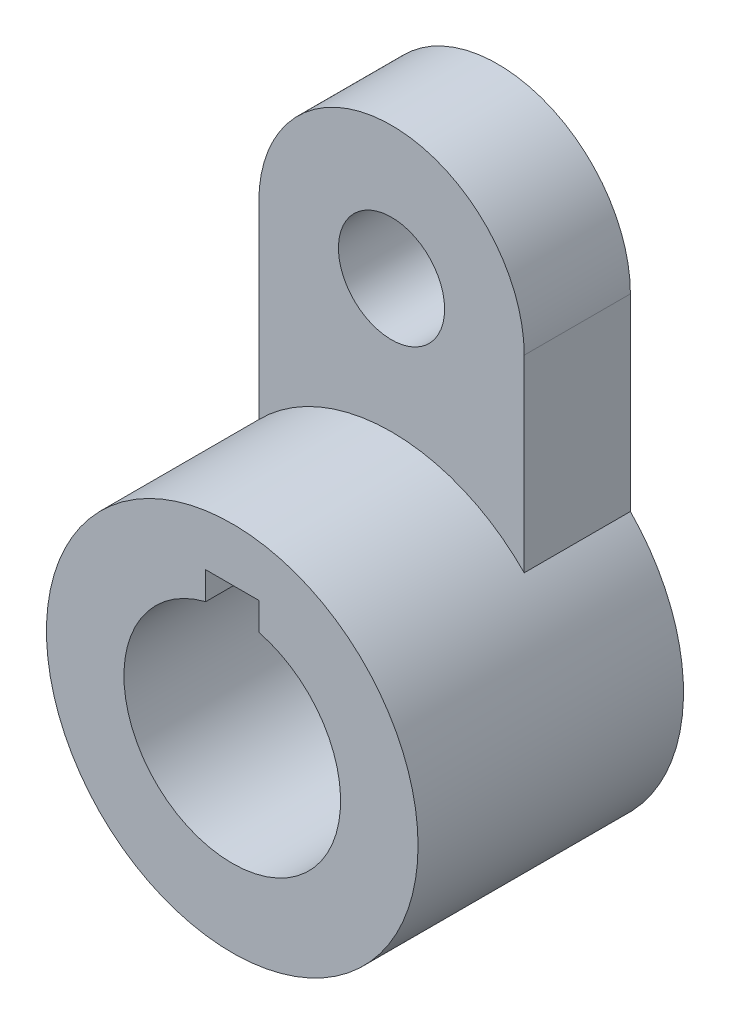
ISO-10303-21;
HEADER;
FILE_DESCRIPTION(('STEP AP214'),'2;1');
FILE_NAME('part.step','',(''),(''),'','','');
FILE_SCHEMA(('AUTOMOTIVE_DESIGN { 1 0 10303 214 1 1 1 1 }'));
ENDSEC;
DATA;
#1=APPLICATION_CONTEXT('core data for automotive mechanical design processes');
#2=APPLICATION_PROTOCOL_DEFINITION('international standard','automotive_design',2000,#1);
#3=PRODUCT_CONTEXT('',#1,'mechanical');
#4=PRODUCT('Part','Part','',(#3));
#5=PRODUCT_RELATED_PRODUCT_CATEGORY('part','',(#4));
#6=PRODUCT_DEFINITION_FORMATION('','',#4);
#7=PRODUCT_DEFINITION_CONTEXT('part definition',#1,'design');
#8=PRODUCT_DEFINITION('design','',#6,#7);
#9=PRODUCT_DEFINITION_SHAPE('','',#8);
#10=(LENGTH_UNIT() NAMED_UNIT(*) SI_UNIT(.MILLI.,.METRE.));
#11=(NAMED_UNIT(*) PLANE_ANGLE_UNIT() SI_UNIT($,.RADIAN.));
#12=(NAMED_UNIT(*) SI_UNIT($,.STERADIAN.) SOLID_ANGLE_UNIT());
#13=UNCERTAINTY_MEASURE_WITH_UNIT(LENGTH_MEASURE(1.E-05),#10,'distance_accuracy_value','');
#14=(GEOMETRIC_REPRESENTATION_CONTEXT(3) GLOBAL_UNCERTAINTY_ASSIGNED_CONTEXT((#13)) GLOBAL_UNIT_ASSIGNED_CONTEXT((#10,
#11,#12)) REPRESENTATION_CONTEXT('',''));
#15=CARTESIAN_POINT('',(0.,0.,0.));
#16=DIRECTION('',(0.,0.,1.));
#17=DIRECTION('',(1.,0.,0.));
#18=AXIS2_PLACEMENT_3D('',#15,#16,#17);
#19=CARTESIAN_POINT('',(0.,0.,31.75));
#20=DIRECTION('',(0.,0.,-1.));
#21=DIRECTION('',(-1.,0.,0.));
#22=AXIS2_PLACEMENT_3D('',#19,#20,#21);
#23=CYLINDRICAL_SURFACE('',#22,22.225);
#24=CARTESIAN_POINT('',(0.,0.,31.75));
#25=DIRECTION('',(0.,0.,1.));
#26=DIRECTION('',(1.,0.,0.));
#27=AXIS2_PLACEMENT_3D('',#24,#25,#26);
#28=CIRCLE('',#27,22.225);
#29=CARTESIAN_POINT('',(22.225,0.,31.75));
#30=VERTEX_POINT('',#29);
#31=EDGE_CURVE('E44',#30,#30,#28,.T.);
#32=ORIENTED_EDGE('',*,*,#31,.F.);
#33=EDGE_LOOP('',(#32));
#34=FACE_BOUND('',#33,.T.);
#35=DIRECTION('',(0.,0.,-1.));
#36=VECTOR('',#35,1.);
#37=CARTESIAN_POINT('',(-15.875,15.5542598666732,31.75));
#38=LINE('',#37,#36);
#39=CARTESIAN_POINT('',(-15.875,15.5542598666732,0.));
#40=VERTEX_POINT('',#39);
#41=CARTESIAN_POINT('',(-15.875,15.5542598666732,12.7));
#42=VERTEX_POINT('',#41);
#43=EDGE_CURVE('E165',#40,#42,#38,.F.);
#44=ORIENTED_EDGE('',*,*,#43,.F.);
#45=CARTESIAN_POINT('',(0.,0.,0.));
#46=DIRECTION('',(0.,0.,1.));
#47=DIRECTION('',(1.,0.,0.));
#48=AXIS2_PLACEMENT_3D('',#45,#46,#47);
#49=CIRCLE('',#48,22.225);
#50=CARTESIAN_POINT('',(15.875,15.5542598666732,0.));
#51=VERTEX_POINT('',#50);
#52=EDGE_CURVE('E168',#40,#51,#49,.T.);
#53=ORIENTED_EDGE('',*,*,#52,.T.);
#54=DIRECTION('',(0.,0.,-1.));
#55=VECTOR('',#54,1.);
#56=CARTESIAN_POINT('',(15.875,15.5542598666732,31.75));
#57=LINE('',#56,#55);
#58=CARTESIAN_POINT('',(15.875,15.5542598666732,12.7));
#59=VERTEX_POINT('',#58);
#60=EDGE_CURVE('E162',#59,#51,#57,.T.);
#61=ORIENTED_EDGE('',*,*,#60,.F.);
#62=CARTESIAN_POINT('',(0.,0.,12.7));
#63=DIRECTION('',(0.,0.,1.));
#64=DIRECTION('',(1.,0.,0.));
#65=AXIS2_PLACEMENT_3D('',#62,#63,#64);
#66=CIRCLE('',#65,22.225);
#67=EDGE_CURVE('E11',#59,#42,#66,.T.);
#68=ORIENTED_EDGE('',*,*,#67,.T.);
#69=EDGE_LOOP('',(#44,#53,#61,#68));
#70=FACE_BOUND('',#69,.T.);
#71=ADVANCED_FACE('F37',(#34,#70),#23,.T.);
#72=CARTESIAN_POINT('',(0.,0.,31.75));
#73=DIRECTION('',(0.,0.,1.));
#74=DIRECTION('',(1.,0.,0.));
#75=AXIS2_PLACEMENT_3D('',#72,#73,#74);
#76=PLANE('',#75);
#77=CARTESIAN_POINT('',(0.,0.,31.75));
#78=DIRECTION('',(0.,0.,1.));
#79=DIRECTION('',(1.,0.,0.));
#80=AXIS2_PLACEMENT_3D('',#77,#78,#79);
#81=CIRCLE('',#80,12.9590100863865);
#82=CARTESIAN_POINT('',(-3.175,12.5640486077963,31.75));
#83=VERTEX_POINT('',#82);
#84=CARTESIAN_POINT('',(3.175,12.5640486077963,31.75));
#85=VERTEX_POINT('',#84);
#86=EDGE_CURVE('E51',#83,#85,#81,.T.);
#87=ORIENTED_EDGE('',*,*,#86,.F.);
#88=DIRECTION('',(0.,-1.,0.));
#89=VECTOR('',#88,1.);
#90=CARTESIAN_POINT('',(-3.175,12.5640486077963,31.75));
#91=LINE('',#90,#89);
#92=CARTESIAN_POINT('',(-3.175,15.875,31.75));
#93=VERTEX_POINT('',#92);
#94=EDGE_CURVE('E118',#93,#83,#91,.T.);
#95=ORIENTED_EDGE('',*,*,#94,.F.);
#96=DIRECTION('',(-1.,0.,0.));
#97=VECTOR('',#96,1.);
#98=CARTESIAN_POINT('',(-3.175,15.875,31.75));
#99=LINE('',#98,#97);
#100=CARTESIAN_POINT('',(3.175,15.875,31.75));
#101=VERTEX_POINT('',#100);
#102=EDGE_CURVE('E121',#101,#93,#99,.T.);
#103=ORIENTED_EDGE('',*,*,#102,.F.);
#104=DIRECTION('',(0.,1.,0.));
#105=VECTOR('',#104,1.);
#106=CARTESIAN_POINT('',(3.175,15.875,31.75));
#107=LINE('',#106,#105);
#108=EDGE_CURVE('E127',#85,#101,#107,.T.);
#109=ORIENTED_EDGE('',*,*,#108,.F.);
#110=EDGE_LOOP('',(#87,#95,#103,#109));
#111=FACE_BOUND('',#110,.T.);
#112=ORIENTED_EDGE('',*,*,#31,.T.);
#113=EDGE_LOOP('',(#112));
#114=FACE_BOUND('',#113,.T.);
#115=ADVANCED_FACE('F201',(#111,#114),#76,.T.);
#116=CARTESIAN_POINT('',(0.,0.,0.));
#117=DIRECTION('',(0.,0.,1.));
#118=DIRECTION('',(1.,0.,0.));
#119=AXIS2_PLACEMENT_3D('',#116,#117,#118);
#120=PLANE('',#119);
#121=DIRECTION('',(0.,-1.,0.));
#122=VECTOR('',#121,1.);
#123=CARTESIAN_POINT('',(-3.175,12.5640486077963,0.));
#124=LINE('',#123,#122);
#125=CARTESIAN_POINT('',(-3.175,15.875,0.));
#126=VERTEX_POINT('',#125);
#127=CARTESIAN_POINT('',(-3.175,12.5640486077963,0.));
#128=VERTEX_POINT('',#127);
#129=EDGE_CURVE('E108',#126,#128,#124,.T.);
#130=ORIENTED_EDGE('',*,*,#129,.T.);
#131=CARTESIAN_POINT('',(0.,0.,0.));
#132=DIRECTION('',(0.,0.,1.));
#133=DIRECTION('',(1.,0.,0.));
#134=AXIS2_PLACEMENT_3D('',#131,#132,#133);
#135=CIRCLE('',#134,12.9590100863865);
#136=CARTESIAN_POINT('',(3.175,12.5640486077963,0.));
#137=VERTEX_POINT('',#136);
#138=EDGE_CURVE('E102',#128,#137,#135,.T.);
#139=ORIENTED_EDGE('',*,*,#138,.T.);
#140=DIRECTION('',(0.,1.,0.));
#141=VECTOR('',#140,1.);
#142=CARTESIAN_POINT('',(3.175,15.875,0.));
#143=LINE('',#142,#141);
#144=CARTESIAN_POINT('',(3.175,15.875,0.));
#145=VERTEX_POINT('',#144);
#146=EDGE_CURVE('E111',#137,#145,#143,.T.);
#147=ORIENTED_EDGE('',*,*,#146,.T.);
#148=DIRECTION('',(-1.,0.,0.));
#149=VECTOR('',#148,1.);
#150=CARTESIAN_POINT('',(-3.175,15.875,0.));
#151=LINE('',#150,#149);
#152=EDGE_CURVE('E59',#145,#126,#151,.T.);
#153=ORIENTED_EDGE('',*,*,#152,.T.);
#154=EDGE_LOOP('',(#130,#139,#147,#153));
#155=FACE_BOUND('',#154,.T.);
#156=ORIENTED_EDGE('',*,*,#52,.F.);
#157=DIRECTION('',(0.,-1.,0.));
#158=VECTOR('',#157,1.);
#159=CARTESIAN_POINT('',(-15.875,7.27172101836337,0.));
#160=LINE('',#159,#158);
#161=CARTESIAN_POINT('',(-15.875,38.1,0.));
#162=VERTEX_POINT('',#161);
#163=EDGE_CURVE('E140',#162,#40,#160,.T.);
#164=ORIENTED_EDGE('',*,*,#163,.F.);
#165=CARTESIAN_POINT('',(0.,38.1,0.));
#166=DIRECTION('',(0.,0.,1.));
#167=DIRECTION('',(1.,0.,0.));
#168=AXIS2_PLACEMENT_3D('',#165,#166,#167);
#169=CIRCLE('',#168,15.875);
#170=CARTESIAN_POINT('',(15.875,38.1,0.));
#171=VERTEX_POINT('',#170);
#172=EDGE_CURVE('E147',#171,#162,#169,.T.);
#173=ORIENTED_EDGE('',*,*,#172,.F.);
#174=DIRECTION('',(0.,1.,0.));
#175=VECTOR('',#174,1.);
#176=CARTESIAN_POINT('',(15.875,7.27172101836337,0.));
#177=LINE('',#176,#175);
#178=EDGE_CURVE('E154',#51,#171,#177,.T.);
#179=ORIENTED_EDGE('',*,*,#178,.F.);
#180=EDGE_LOOP('',(#156,#164,#173,#179));
#181=FACE_BOUND('',#180,.T.);
#182=CARTESIAN_POINT('',(0.,38.1,0.));
#183=DIRECTION('',(0.,0.,1.));
#184=DIRECTION('',(1.,0.,0.));
#185=AXIS2_PLACEMENT_3D('',#182,#183,#184);
#186=CIRCLE('',#185,6.35);
#187=CARTESIAN_POINT('',(6.35,38.1,0.));
#188=VERTEX_POINT('',#187);
#189=EDGE_CURVE('E133',#188,#188,#186,.T.);
#190=ORIENTED_EDGE('',*,*,#189,.T.);
#191=EDGE_LOOP('',(#190));
#192=FACE_BOUND('',#191,.T.);
#193=ADVANCED_FACE('F115',(#155,#181,#192),#120,.F.);
#194=CARTESIAN_POINT('',(-15.875,7.27172101836337,12.7));
#195=DIRECTION('',(1.,0.,0.));
#196=DIRECTION('',(0.,0.,-1.));
#197=AXIS2_PLACEMENT_3D('',#194,#195,#196);
#198=PLANE('',#197);
#199=ORIENTED_EDGE('',*,*,#163,.T.);
#200=ORIENTED_EDGE('',*,*,#43,.T.);
#201=DIRECTION('',(0.,-1.,0.));
#202=VECTOR('',#201,1.);
#203=CARTESIAN_POINT('',(-15.875,7.27172101836337,12.7));
#204=LINE('',#203,#202);
#205=CARTESIAN_POINT('',(-15.875,38.1,12.7));
#206=VERTEX_POINT('',#205);
#207=EDGE_CURVE('E143',#206,#42,#204,.T.);
#208=ORIENTED_EDGE('',*,*,#207,.F.);
#209=DIRECTION('',(0.,0.,-1.));
#210=VECTOR('',#209,1.);
#211=CARTESIAN_POINT('',(-15.875,38.1,12.7));
#212=LINE('',#211,#210);
#213=EDGE_CURVE('E151',#206,#162,#212,.T.);
#214=ORIENTED_EDGE('',*,*,#213,.T.);
#215=EDGE_LOOP('',(#199,#200,#208,#214));
#216=FACE_BOUND('',#215,.T.);
#217=ADVANCED_FACE('F187',(#216),#198,.F.);
#218=CARTESIAN_POINT('',(15.875,7.27172101836337,12.7));
#219=DIRECTION('',(-1.,0.,0.));
#220=DIRECTION('',(0.,0.,1.));
#221=AXIS2_PLACEMENT_3D('',#218,#219,#220);
#222=PLANE('',#221);
#223=DIRECTION('',(0.,1.,0.));
#224=VECTOR('',#223,1.);
#225=CARTESIAN_POINT('',(15.875,7.27172101836337,12.7));
#226=LINE('',#225,#224);
#227=CARTESIAN_POINT('',(15.875,38.1,12.7));
#228=VERTEX_POINT('',#227);
#229=EDGE_CURVE('E146',#59,#228,#226,.T.);
#230=ORIENTED_EDGE('',*,*,#229,.F.);
#231=ORIENTED_EDGE('',*,*,#60,.T.);
#232=ORIENTED_EDGE('',*,*,#178,.T.);
#233=DIRECTION('',(0.,0.,-1.));
#234=VECTOR('',#233,1.);
#235=CARTESIAN_POINT('',(15.875,38.1,12.7));
#236=LINE('',#235,#234);
#237=EDGE_CURVE('E159',#228,#171,#236,.T.);
#238=ORIENTED_EDGE('',*,*,#237,.F.);
#239=EDGE_LOOP('',(#230,#231,#232,#238));
#240=FACE_BOUND('',#239,.T.);
#241=ADVANCED_FACE('F177',(#240),#222,.F.);
#242=CARTESIAN_POINT('',(0.,38.1,12.7));
#243=DIRECTION('',(0.,0.,1.));
#244=DIRECTION('',(1.,0.,0.));
#245=AXIS2_PLACEMENT_3D('',#242,#243,#244);
#246=PLANE('',#245);
#247=ORIENTED_EDGE('',*,*,#67,.F.);
#248=ORIENTED_EDGE('',*,*,#229,.T.);
#249=CARTESIAN_POINT('',(0.,38.1,12.7));
#250=DIRECTION('',(0.,0.,1.));
#251=DIRECTION('',(1.,0.,0.));
#252=AXIS2_PLACEMENT_3D('',#249,#250,#251);
#253=CIRCLE('',#252,15.875);
#254=EDGE_CURVE('E149',#228,#206,#253,.T.);
#255=ORIENTED_EDGE('',*,*,#254,.T.);
#256=ORIENTED_EDGE('',*,*,#207,.T.);
#257=EDGE_LOOP('',(#247,#248,#255,#256));
#258=FACE_BOUND('',#257,.T.);
#259=CARTESIAN_POINT('',(0.,38.1,12.7));
#260=DIRECTION('',(0.,0.,1.));
#261=DIRECTION('',(1.,0.,0.));
#262=AXIS2_PLACEMENT_3D('',#259,#260,#261);
#263=CIRCLE('',#262,6.35);
#264=CARTESIAN_POINT('',(6.35,38.1,12.7));
#265=VERTEX_POINT('',#264);
#266=EDGE_CURVE('E137',#265,#265,#263,.T.);
#267=ORIENTED_EDGE('',*,*,#266,.F.);
#268=EDGE_LOOP('',(#267));
#269=FACE_BOUND('',#268,.T.);
#270=ADVANCED_FACE('F189',(#258,#269),#246,.T.);
#271=CARTESIAN_POINT('',(0.,38.1,12.7));
#272=DIRECTION('',(0.,0.,-1.));
#273=DIRECTION('',(-1.,0.,0.));
#274=AXIS2_PLACEMENT_3D('',#271,#272,#273);
#275=CYLINDRICAL_SURFACE('',#274,15.875);
#276=ORIENTED_EDGE('',*,*,#172,.T.);
#277=ORIENTED_EDGE('',*,*,#213,.F.);
#278=ORIENTED_EDGE('',*,*,#254,.F.);
#279=ORIENTED_EDGE('',*,*,#237,.T.);
#280=EDGE_LOOP('',(#276,#277,#278,#279));
#281=FACE_BOUND('',#280,.T.);
#282=ADVANCED_FACE('F183',(#281),#275,.T.);
#283=CARTESIAN_POINT('',(0.,38.1,12.7));
#284=DIRECTION('',(0.,0.,-1.));
#285=DIRECTION('',(-1.,0.,0.));
#286=AXIS2_PLACEMENT_3D('',#283,#284,#285);
#287=CYLINDRICAL_SURFACE('',#286,6.35);
#288=ORIENTED_EDGE('',*,*,#266,.T.);
#289=EDGE_LOOP('',(#288));
#290=FACE_BOUND('',#289,.T.);
#291=ORIENTED_EDGE('',*,*,#189,.F.);
#292=EDGE_LOOP('',(#291));
#293=FACE_BOUND('',#292,.T.);
#294=ADVANCED_FACE('F195',(#290,#293),#287,.F.);
#295=CARTESIAN_POINT('',(0.,0.,0.));
#296=DIRECTION('',(0.,0.,1.));
#297=DIRECTION('',(1.,0.,0.));
#298=AXIS2_PLACEMENT_3D('',#295,#296,#297);
#299=CYLINDRICAL_SURFACE('',#298,12.9590100863865);
#300=ORIENTED_EDGE('',*,*,#86,.T.);
#301=DIRECTION('',(0.,0.,1.));
#302=VECTOR('',#301,1.);
#303=CARTESIAN_POINT('',(3.175,12.5640486077963,0.));
#304=LINE('',#303,#302);
#305=EDGE_CURVE('E98',#137,#85,#304,.T.);
#306=ORIENTED_EDGE('',*,*,#305,.F.);
#307=ORIENTED_EDGE('',*,*,#138,.F.);
#308=DIRECTION('',(0.,0.,1.));
#309=VECTOR('',#308,1.);
#310=CARTESIAN_POINT('',(-3.175,12.5640486077963,0.));
#311=LINE('',#310,#309);
#312=EDGE_CURVE('E131',#128,#83,#311,.T.);
#313=ORIENTED_EDGE('',*,*,#312,.T.);
#314=EDGE_LOOP('',(#300,#306,#307,#313));
#315=FACE_BOUND('',#314,.T.);
#316=ADVANCED_FACE('F100',(#315),#299,.F.);
#317=CARTESIAN_POINT('',(-3.175,12.5640486077963,0.));
#318=DIRECTION('',(-1.,0.,0.));
#319=DIRECTION('',(0.,0.,1.));
#320=AXIS2_PLACEMENT_3D('',#317,#318,#319);
#321=PLANE('',#320);
#322=ORIENTED_EDGE('',*,*,#94,.T.);
#323=ORIENTED_EDGE('',*,*,#312,.F.);
#324=ORIENTED_EDGE('',*,*,#129,.F.);
#325=DIRECTION('',(0.,0.,1.));
#326=VECTOR('',#325,1.);
#327=CARTESIAN_POINT('',(-3.175,15.875,0.));
#328=LINE('',#327,#326);
#329=EDGE_CURVE('E134',#126,#93,#328,.T.);
#330=ORIENTED_EDGE('',*,*,#329,.T.);
#331=EDGE_LOOP('',(#322,#323,#324,#330));
#332=FACE_BOUND('',#331,.T.);
#333=ADVANCED_FACE('F239',(#332),#321,.F.);
#334=CARTESIAN_POINT('',(-3.175,15.875,0.));
#335=DIRECTION('',(0.,1.,0.));
#336=DIRECTION('',(0.,0.,1.));
#337=AXIS2_PLACEMENT_3D('',#334,#335,#336);
#338=PLANE('',#337);
#339=ORIENTED_EDGE('',*,*,#102,.T.);
#340=ORIENTED_EDGE('',*,*,#329,.F.);
#341=ORIENTED_EDGE('',*,*,#152,.F.);
#342=DIRECTION('',(0.,0.,1.));
#343=VECTOR('',#342,1.);
#344=CARTESIAN_POINT('',(3.175,15.875,0.));
#345=LINE('',#344,#343);
#346=EDGE_CURVE('E107',#145,#101,#345,.T.);
#347=ORIENTED_EDGE('',*,*,#346,.T.);
#348=EDGE_LOOP('',(#339,#340,#341,#347));
#349=FACE_BOUND('',#348,.T.);
#350=ADVANCED_FACE('F248',(#349),#338,.F.);
#351=CARTESIAN_POINT('',(3.175,15.875,0.));
#352=DIRECTION('',(1.,0.,0.));
#353=DIRECTION('',(0.,1.,0.));
#354=AXIS2_PLACEMENT_3D('',#351,#352,#353);
#355=PLANE('',#354);
#356=ORIENTED_EDGE('',*,*,#108,.T.);
#357=ORIENTED_EDGE('',*,*,#346,.F.);
#358=ORIENTED_EDGE('',*,*,#146,.F.);
#359=ORIENTED_EDGE('',*,*,#305,.T.);
#360=EDGE_LOOP('',(#356,#357,#358,#359));
#361=FACE_BOUND('',#360,.T.);
#362=ADVANCED_FACE('F112',(#361),#355,.F.);
#363=CLOSED_SHELL('',(#71,#115,#193,#217,#241,#270,#282,#294,#316,#333,#350,#362));
#364=MANIFOLD_SOLID_BREP('B2',#363);
#365=ADVANCED_BREP_SHAPE_REPRESENTATION('',(#18,#364),#14);
#366=SHAPE_DEFINITION_REPRESENTATION(#9,#365);
ENDSEC;
END-ISO-10303-21;
